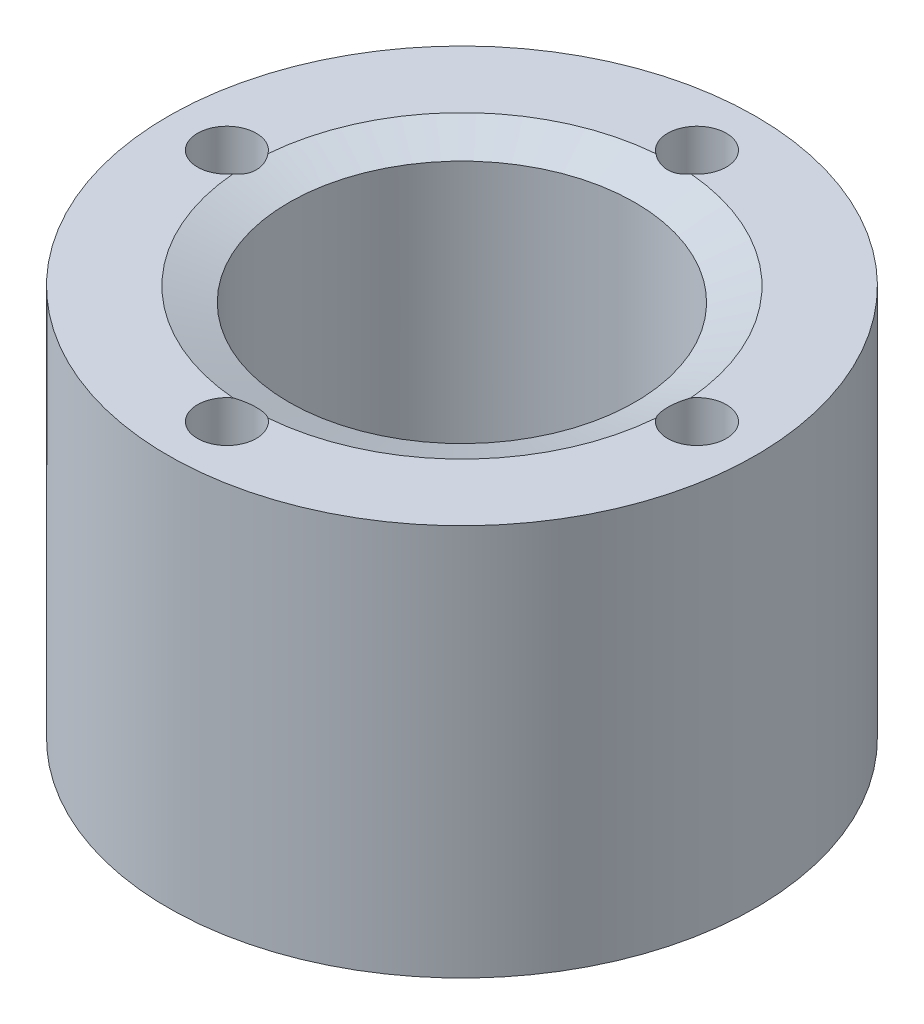
ISO-10303-21;
HEADER;
FILE_DESCRIPTION(('STEP AP214'),'2;1');
FILE_NAME('part.step','',(''),(''),'','','');
FILE_SCHEMA(('AUTOMOTIVE_DESIGN { 1 0 10303 214 1 1 1 1 }'));
ENDSEC;
DATA;
#1=APPLICATION_CONTEXT('core data for automotive mechanical design processes');
#2=APPLICATION_PROTOCOL_DEFINITION('international standard','automotive_design',2000,#1);
#3=PRODUCT_CONTEXT('',#1,'mechanical');
#4=PRODUCT('Part','Part','',(#3));
#5=PRODUCT_RELATED_PRODUCT_CATEGORY('part','',(#4));
#6=PRODUCT_DEFINITION_FORMATION('','',#4);
#7=PRODUCT_DEFINITION_CONTEXT('part definition',#1,'design');
#8=PRODUCT_DEFINITION('design','',#6,#7);
#9=PRODUCT_DEFINITION_SHAPE('','',#8);
#10=(LENGTH_UNIT() NAMED_UNIT(*) SI_UNIT(.MILLI.,.METRE.));
#11=(NAMED_UNIT(*) PLANE_ANGLE_UNIT() SI_UNIT($,.RADIAN.));
#12=(NAMED_UNIT(*) SI_UNIT($,.STERADIAN.) SOLID_ANGLE_UNIT());
#13=UNCERTAINTY_MEASURE_WITH_UNIT(LENGTH_MEASURE(1.E-05),#10,'distance_accuracy_value','');
#14=(GEOMETRIC_REPRESENTATION_CONTEXT(3) GLOBAL_UNCERTAINTY_ASSIGNED_CONTEXT((#13)) GLOBAL_UNIT_ASSIGNED_CONTEXT((#10,
#11,#12)) REPRESENTATION_CONTEXT('',''));
#15=CARTESIAN_POINT('',(0.,0.,0.));
#16=DIRECTION('',(0.,0.,1.));
#17=DIRECTION('',(1.,0.,0.));
#18=AXIS2_PLACEMENT_3D('',#15,#16,#17);
#19=CARTESIAN_POINT('',(0.,30.,0.));
#20=DIRECTION('',(0.,-1.,0.));
#21=DIRECTION('',(0.,0.,-1.));
#22=AXIS2_PLACEMENT_3D('',#19,#20,#21);
#23=CYLINDRICAL_SURFACE('',#22,13.25);
#24=CARTESIAN_POINT('',(0.,28.9080892972014,0.));
#25=DIRECTION('',(0.,1.,0.));
#26=DIRECTION('',(0.,0.,1.));
#27=AXIS2_PLACEMENT_3D('',#24,#25,#26);
#28=CIRCLE('',#27,13.25);
#29=CARTESIAN_POINT('',(0.,28.9080892972014,13.25));
#30=VERTEX_POINT('',#29);
#31=EDGE_CURVE('E98',#30,#30,#28,.T.);
#32=ORIENTED_EDGE('',*,*,#31,.T.);
#33=EDGE_LOOP('',(#32));
#34=FACE_BOUND('',#33,.T.);
#35=CARTESIAN_POINT('',(0.,1.09191070279863,0.));
#36=DIRECTION('',(0.,-1.,0.));
#37=DIRECTION('',(0.,0.,-1.));
#38=AXIS2_PLACEMENT_3D('',#35,#36,#37);
#39=CIRCLE('',#38,13.25);
#40=CARTESIAN_POINT('',(0.,1.09191070279863,-13.25));
#41=VERTEX_POINT('',#40);
#42=EDGE_CURVE('E199',#41,#41,#39,.T.);
#43=ORIENTED_EDGE('',*,*,#42,.T.);
#44=EDGE_LOOP('',(#43));
#45=FACE_BOUND('',#44,.T.);
#46=ADVANCED_FACE('F16',(#34,#45),#23,.F.);
#47=CARTESIAN_POINT('',(0.,30.,0.));
#48=DIRECTION('',(0.,1.,0.));
#49=DIRECTION('',(-1.,0.,0.));
#50=AXIS2_PLACEMENT_3D('',#47,#48,#49);
#51=CONICAL_SURFACE('',#50,16.25,1.22173047639602);
#52=CARTESIAN_POINT('',(-1.34256066373274,30.,16.1944444444445));
#53=CARTESIAN_POINT('',(-1.29503569508663,29.9857533773835,16.1591074446449));
#54=CARTESIAN_POINT('',(-1.24600466792052,29.9721782862931,16.125564186826));
#55=CARTESIAN_POINT('',(-1.14515117916577,29.9464959238673,16.0623007528374));
#56=CARTESIAN_POINT('',(-1.09332792171034,29.9343890742543,16.0325816749361));
#57=CARTESIAN_POINT('',(-0.933986717875354,29.9004578134465,15.9495137717135));
#58=CARTESIAN_POINT('',(-0.82264848283137,29.8810381470335,15.9022924579782));
#59=CARTESIAN_POINT('',(-0.594410366992921,29.8498309644823,15.8266483902487));
#60=CARTESIAN_POINT('',(-0.477601098527234,29.8379479385341,15.7979902861387));
#61=CARTESIAN_POINT('',(-0.240524023694858,29.8220455159651,15.7596796530654));
#62=CARTESIAN_POINT('',(-0.120261376206534,29.8180149517097,15.7500001329639));
#63=CARTESIAN_POINT('',(0.119581532663591,29.8180148144133,15.7499998677877));
#64=CARTESIAN_POINT('',(0.239161808378006,29.8219998009926,15.7595699959227));
#65=CARTESIAN_POINT('',(0.474930831243424,29.8377238392663,15.7974499501194));
#66=CARTESIAN_POINT('',(0.59111460472309,29.8494737204589,15.8257859485747));
#67=CARTESIAN_POINT('',(0.819501545613403,29.8805154499194,15.9010220625527));
#68=CARTESIAN_POINT('',(0.931537054048236,29.8999853076737,15.9483606908741));
#69=CARTESIAN_POINT('',(1.09185399022661,29.934051173427,16.0317526739331));
#70=CARTESIAN_POINT('',(1.1439938037957,29.9462136866357,16.0616067087508));
#71=CARTESIAN_POINT('',(1.2454496791413,29.9720247024115,16.1251846888387));
#72=CARTESIAN_POINT('',(1.29476658412527,29.9856727576729,16.1589074693706));
#73=CARTESIAN_POINT('',(1.34256066373274,30.,16.1944444444445));
#74=B_SPLINE_CURVE_WITH_KNOTS('',3,(#52,#53,#54,#55,#56,#57,#58,#59,#60,#61,#62,#63,#64,#65,#66,
#67,#68,#69,#70,#71,#72,#73),.UNSPECIFIED.,.F.,.F.,(4,2,2,2,2,2,2,2,2,2,4),(0.,
0.182638632111473,0.365329599802466,0.730906159337628,1.09175208207853,1.45208444031118,
1.81037982179547,2.1691759661915,2.53677725279807,2.72050348857454,2.90417455552269),.UNSPECIFIED.);
#75=CARTESIAN_POINT('',(-1.34256066373275,30.,16.1944444444444));
#76=VERTEX_POINT('',#75);
#77=CARTESIAN_POINT('',(1.34256066373274,30.,16.1944444444444));
#78=VERTEX_POINT('',#77);
#79=EDGE_CURVE('E19',#76,#78,#74,.T.);
#80=ORIENTED_EDGE('',*,*,#79,.T.);
#81=CARTESIAN_POINT('',(0.,30.,0.));
#82=DIRECTION('',(0.,1.,0.));
#83=DIRECTION('',(-1.,0.,0.));
#84=AXIS2_PLACEMENT_3D('',#81,#82,#83);
#85=CIRCLE('',#84,16.25);
#86=CARTESIAN_POINT('',(16.1944444444444,30.,1.34256066373274));
#87=VERTEX_POINT('',#86);
#88=EDGE_CURVE('E91',#87,#78,#85,.F.);
#89=ORIENTED_EDGE('',*,*,#88,.F.);
#90=CARTESIAN_POINT('',(16.1944444444445,30.,1.34256066373273));
#91=CARTESIAN_POINT('',(16.159110134315,29.985754459926,1.29503946985212));
#92=CARTESIAN_POINT('',(16.1255692402411,29.9721803304749,1.24601213187014));
#93=CARTESIAN_POINT('',(16.0623103242905,29.9464998167678,1.14516703091528));
#94=CARTESIAN_POINT('',(16.0325933538891,29.9343938362654,1.09334850597466));
#95=CARTESIAN_POINT('',(15.9495215123837,29.9004609925795,0.934005193148864));
#96=CARTESIAN_POINT('',(15.9022959346177,29.8810395590758,0.822659940178594));
#97=CARTESIAN_POINT('',(15.8260755658941,29.8495946664111,0.59268103538089));
#98=CARTESIAN_POINT('',(15.7971177117628,29.8375861971003,0.474033145787141));
#99=CARTESIAN_POINT('',(15.7588103820512,29.8216841974014,0.233232691182156));
#100=CARTESIAN_POINT('',(15.7494313179909,29.8177784218589,0.111085697834837));
#101=CARTESIAN_POINT('',(15.750601997425,29.8182652050651,-0.128891085036639));
#102=CARTESIAN_POINT('',(15.7604795811715,29.8223778776123,-0.246725326555691));
#103=CARTESIAN_POINT('',(15.7984317016072,29.8381308451059,-0.479037068103916));
#104=CARTESIAN_POINT('',(15.8265300121784,29.8497809746649,-0.593509978101817));
#105=CARTESIAN_POINT('',(15.9012743072178,29.8806192553182,-0.820124558448079));
#106=CARTESIAN_POINT('',(15.9485849998499,29.9000772191653,-0.932012026448576));
#107=CARTESIAN_POINT('',(16.0319076583594,29.9341143449175,-1.09212989280819));
#108=CARTESIAN_POINT('',(16.0617366828625,29.9462665417624,-1.14421075514716));
#109=CARTESIAN_POINT('',(16.1252559511259,29.9720535435632,-1.24555384216829));
#110=CARTESIAN_POINT('',(16.1589449967141,29.9856878883851,-1.29481693442214));
#111=CARTESIAN_POINT('',(16.1944444444444,30.,-1.34256066373274));
#112=B_SPLINE_CURVE_WITH_KNOTS('',3,(#90,#91,#92,#93,#94,#95,#96,#97,#98,#99,#100,#101,#102,
#103,#104,#105,#106,#107,#108,#109,#110,#111),.UNSPECIFIED.,.F.,.F.,(4,2,2,2,2,2,2,2,2,2,4),(0.,
0.182624936310918,0.365299982701682,0.730906079889577,1.09724907271524,1.46303802706697,
1.81628732380458,2.16999846002199,2.5371607603491,2.72069469678008,2.9041718167991),.UNSPECIFIED.);
#113=CARTESIAN_POINT('',(16.1944444444444,30.,-1.34256066373274));
#114=VERTEX_POINT('',#113);
#115=EDGE_CURVE('E126',#87,#114,#112,.T.);
#116=ORIENTED_EDGE('',*,*,#115,.T.);
#117=CARTESIAN_POINT('',(0.,30.,0.));
#118=DIRECTION('',(0.,1.,0.));
#119=DIRECTION('',(-1.,0.,0.));
#120=AXIS2_PLACEMENT_3D('',#117,#118,#119);
#121=CIRCLE('',#120,16.25);
#122=CARTESIAN_POINT('',(1.34256066373275,30.,-16.1944444444444));
#123=VERTEX_POINT('',#122);
#124=EDGE_CURVE('E107',#123,#114,#121,.F.);
#125=ORIENTED_EDGE('',*,*,#124,.F.);
#126=CARTESIAN_POINT('',(1.34256066373274,30.,-16.1944444444445));
#127=CARTESIAN_POINT('',(1.29503569508663,29.9857533773835,-16.1591074446449));
#128=CARTESIAN_POINT('',(1.24600466792052,29.9721782862931,-16.125564186826));
#129=CARTESIAN_POINT('',(1.14515117916578,29.9464959238673,-16.0623007528374));
#130=CARTESIAN_POINT('',(1.09332792171034,29.9343890742543,-16.0325816749361));
#131=CARTESIAN_POINT('',(0.933986717875358,29.9004578134465,-15.9495137717135));
#132=CARTESIAN_POINT('',(0.822648482831374,29.8810381470335,-15.9022924579782));
#133=CARTESIAN_POINT('',(0.594410366992925,29.8498309644823,-15.8266483902487));
#134=CARTESIAN_POINT('',(0.477601098527238,29.8379479385341,-15.7979902861387));
#135=CARTESIAN_POINT('',(0.240524023694862,29.8220455159651,-15.7596796530654));
#136=CARTESIAN_POINT('',(0.120261376206539,29.8180149517097,-15.7500001329639));
#137=CARTESIAN_POINT('',(-0.119581532663586,29.8180148144133,-15.7499998677877));
#138=CARTESIAN_POINT('',(-0.239161808378,29.8219998009926,-15.7595699959227));
#139=CARTESIAN_POINT('',(-0.474930831243418,29.8377238392663,-15.7974499501194));
#140=CARTESIAN_POINT('',(-0.591114604723084,29.8494737204589,-15.8257859485747));
#141=CARTESIAN_POINT('',(-0.819501545613396,29.8805154499194,-15.9010220625527));
#142=CARTESIAN_POINT('',(-0.931537054048228,29.8999853076737,-15.9483606908741));
#143=CARTESIAN_POINT('',(-1.09185399022661,29.934051173427,-16.0317526739331));
#144=CARTESIAN_POINT('',(-1.1439938037957,29.9462136866357,-16.0616067087508));
#145=CARTESIAN_POINT('',(-1.24544967914129,29.9720247024115,-16.1251846888387));
#146=CARTESIAN_POINT('',(-1.29476658412526,29.9856727576729,-16.1589074693706));
#147=CARTESIAN_POINT('',(-1.34256066373273,30.,-16.1944444444444));
#148=B_SPLINE_CURVE_WITH_KNOTS('',3,(#126,#127,#128,#129,#130,#131,#132,#133,#134,#135,#136,
#137,#138,#139,#140,#141,#142,#143,#144,#145,#146,#147),.UNSPECIFIED.,.F.,.F.,(4,2,2,2,2,2,2,2,
2,2,4),(0.,0.182638632111473,0.365329599802466,0.730906159337632,1.09175208207853,
1.45208444031118,1.81037982179547,2.1691759661915,2.53677725279807,2.72050348857454,
2.90417455552268),.UNSPECIFIED.);
#149=CARTESIAN_POINT('',(-1.34256066373273,30.,-16.1944444444444));
#150=VERTEX_POINT('',#149);
#151=EDGE_CURVE('E187',#123,#150,#148,.T.);
#152=ORIENTED_EDGE('',*,*,#151,.T.);
#153=CARTESIAN_POINT('',(0.,30.,0.));
#154=DIRECTION('',(0.,1.,0.));
#155=DIRECTION('',(-1.,0.,0.));
#156=AXIS2_PLACEMENT_3D('',#153,#154,#155);
#157=CIRCLE('',#156,16.25);
#158=CARTESIAN_POINT('',(-16.1944444444444,30.,-1.34256066373275));
#159=VERTEX_POINT('',#158);
#160=EDGE_CURVE('E115',#159,#150,#157,.F.);
#161=ORIENTED_EDGE('',*,*,#160,.F.);
#162=CARTESIAN_POINT('',(-16.1944444444445,30.,-1.34256066373274));
#163=CARTESIAN_POINT('',(-16.159110134315,29.985754459926,-1.29503946985214));
#164=CARTESIAN_POINT('',(-16.1255692402411,29.9721803304749,-1.24601213187015));
#165=CARTESIAN_POINT('',(-16.0623103242905,29.9464998167678,-1.1451670309153));
#166=CARTESIAN_POINT('',(-16.0325933538891,29.9343938362654,-1.09334850597468));
#167=CARTESIAN_POINT('',(-15.9495215123837,29.9004609925795,-0.934005193148878));
#168=CARTESIAN_POINT('',(-15.9022959346177,29.8810395590758,-0.82265994017861));
#169=CARTESIAN_POINT('',(-15.8260755658941,29.8495946664111,-0.592681035380907));
#170=CARTESIAN_POINT('',(-15.7971177117628,29.8375861971003,-0.474033145787157));
#171=CARTESIAN_POINT('',(-15.7588103820512,29.8216841974014,-0.233232691182173));
#172=CARTESIAN_POINT('',(-15.7494313179909,29.8177784218589,-0.111085697834854));
#173=CARTESIAN_POINT('',(-15.750601997425,29.8182652050651,0.128891085036622));
#174=CARTESIAN_POINT('',(-15.7604795811715,29.8223778776123,0.246725326555674));
#175=CARTESIAN_POINT('',(-15.7984317016072,29.8381308451059,0.479037068103899));
#176=CARTESIAN_POINT('',(-15.8265300121784,29.8497809746649,0.5935099781018));
#177=CARTESIAN_POINT('',(-15.9012743072178,29.8806192553182,0.820124558448067));
#178=CARTESIAN_POINT('',(-15.9485849998499,29.9000772191653,0.932012026448567));
#179=CARTESIAN_POINT('',(-16.0319076583594,29.9341143449175,1.09212989280819));
#180=CARTESIAN_POINT('',(-16.0617366828625,29.9462665417624,1.14421075514716));
#181=CARTESIAN_POINT('',(-16.1252559511259,29.9720535435632,1.24555384216829));
#182=CARTESIAN_POINT('',(-16.1589449967141,29.9856878883851,1.29481693442215));
#183=CARTESIAN_POINT('',(-16.1944444444444,30.,1.34256066373274));
#184=B_SPLINE_CURVE_WITH_KNOTS('',3,(#162,#163,#164,#165,#166,#167,#168,#169,#170,#171,#172,
#173,#174,#175,#176,#177,#178,#179,#180,#181,#182,#183),.UNSPECIFIED.,.F.,.F.,(4,2,2,2,2,2,2,2,
2,2,4),(0.,0.182624936310919,0.365299982701681,0.730906079889576,1.09724907271524,
1.46303802706697,1.81628732380458,2.16999846002199,2.53716076034912,2.7206946967801,
2.90417181679912),.UNSPECIFIED.);
#185=CARTESIAN_POINT('',(-16.1944444444444,30.,1.34256066373274));
#186=VERTEX_POINT('',#185);
#187=EDGE_CURVE('E97',#159,#186,#184,.T.);
#188=ORIENTED_EDGE('',*,*,#187,.T.);
#189=CARTESIAN_POINT('',(0.,30.,0.));
#190=DIRECTION('',(0.,1.,0.));
#191=DIRECTION('',(-1.,0.,0.));
#192=AXIS2_PLACEMENT_3D('',#189,#190,#191);
#193=CIRCLE('',#192,16.25);
#194=EDGE_CURVE('E95',#76,#186,#193,.F.);
#195=ORIENTED_EDGE('',*,*,#194,.F.);
#196=EDGE_LOOP('',(#80,#89,#116,#125,#152,#161,#188,#195));
#197=FACE_BOUND('',#196,.T.);
#198=ORIENTED_EDGE('',*,*,#31,.F.);
#199=EDGE_LOOP('',(#198));
#200=FACE_BOUND('',#199,.T.);
#201=ADVANCED_FACE('F87',(#197,#200),#51,.F.);
#202=CARTESIAN_POINT('',(0.,30.,18.));
#203=DIRECTION('',(0.,-1.,0.));
#204=DIRECTION('',(0.,0.,-1.));
#205=AXIS2_PLACEMENT_3D('',#202,#203,#204);
#206=CYLINDRICAL_SURFACE('',#205,2.25);
#207=CARTESIAN_POINT('',(0.,0.,18.));
#208=DIRECTION('',(0.,-1.,0.));
#209=DIRECTION('',(0.,0.,-1.));
#210=AXIS2_PLACEMENT_3D('',#207,#208,#209);
#211=CIRCLE('',#210,2.25);
#212=CARTESIAN_POINT('',(1.34256066373275,0.,16.1944444444444));
#213=VERTEX_POINT('',#212);
#214=CARTESIAN_POINT('',(-1.34256066373273,0.,16.1944444444444));
#215=VERTEX_POINT('',#214);
#216=EDGE_CURVE('E173',#213,#215,#211,.T.);
#217=ORIENTED_EDGE('',*,*,#216,.T.);
#218=CARTESIAN_POINT('',(-1.34256066373273,0.,16.1944444444444));
#219=CARTESIAN_POINT('',(-1.29503569508662,0.0142466226164699,16.1591074446449));
#220=CARTESIAN_POINT('',(-1.24600466792051,0.0278217137069305,16.125564186826));
#221=CARTESIAN_POINT('',(-1.14515117916577,0.0535040761326943,16.0623007528374));
#222=CARTESIAN_POINT('',(-1.09332792171033,0.0656109257457098,16.0325816749361));
#223=CARTESIAN_POINT('',(-0.933986717875347,0.0995421865535054,15.9495137717135));
#224=CARTESIAN_POINT('',(-0.822648482831363,0.11896185296652,15.9022924579782));
#225=CARTESIAN_POINT('',(-0.594410366992914,0.15016903551766,15.8266483902487));
#226=CARTESIAN_POINT('',(-0.477601098527227,0.16205206146588,15.7979902861387));
#227=CARTESIAN_POINT('',(-0.240524023694854,0.177954484034902,15.7596796530654));
#228=CARTESIAN_POINT('',(-0.120261376206532,0.181985048290327,15.7500001329639));
#229=CARTESIAN_POINT('',(0.119581532663591,0.181985185586717,15.7499998677877));
#230=CARTESIAN_POINT('',(0.239161808378005,0.178000199007441,15.7595699959227));
#231=CARTESIAN_POINT('',(0.474930831243423,0.162276160733746,15.7974499501194));
#232=CARTESIAN_POINT('',(0.591114604723089,0.150526279541051,15.8257859485747));
#233=CARTESIAN_POINT('',(0.819501545613403,0.119484550080599,15.9010220625527));
#234=CARTESIAN_POINT('',(0.931537054048235,0.100014692326252,15.9483606908741));
#235=CARTESIAN_POINT('',(1.09185399022661,0.0659488265730061,16.0317526739331));
#236=CARTESIAN_POINT('',(1.1439938037957,0.0537863133642726,16.0616067087508));
#237=CARTESIAN_POINT('',(1.2454496791413,0.027975297588502,16.1251846888387));
#238=CARTESIAN_POINT('',(1.29476658412527,0.0143272423270716,16.1589074693706));
#239=CARTESIAN_POINT('',(1.34256066373274,0.,16.1944444444445));
#240=B_SPLINE_CURVE_WITH_KNOTS('',3,(#218,#219,#220,#221,#222,#223,#224,#225,#226,#227,#228,
#229,#230,#231,#232,#233,#234,#235,#236,#237,#238,#239),.UNSPECIFIED.,.F.,.F.,(4,2,2,2,2,2,2,2,
2,2,4),(0.,0.182638632111475,0.365329599802468,0.730906159337632,1.09175208207853,
1.45208444031118,1.81037982179546,2.16917596619149,2.53677725279806,2.72050348857454,
2.90417455552268),.UNSPECIFIED.);
#241=EDGE_CURVE('E190',#215,#213,#240,.T.);
#242=ORIENTED_EDGE('',*,*,#241,.T.);
#243=EDGE_LOOP('',(#217,#242));
#244=FACE_BOUND('',#243,.T.);
#245=CARTESIAN_POINT('',(0.,30.,18.));
#246=DIRECTION('',(0.,-1.,0.));
#247=DIRECTION('',(0.,0.,-1.));
#248=AXIS2_PLACEMENT_3D('',#245,#246,#247);
#249=CIRCLE('',#248,2.25);
#250=EDGE_CURVE('E99',#78,#76,#249,.T.);
#251=ORIENTED_EDGE('',*,*,#250,.F.);
#252=ORIENTED_EDGE('',*,*,#79,.F.);
#253=EDGE_LOOP('',(#251,#252));
#254=FACE_BOUND('',#253,.T.);
#255=ADVANCED_FACE('F100',(#244,#254),#206,.F.);
#256=CARTESIAN_POINT('',(-18.,30.,0.));
#257=DIRECTION('',(0.,-1.,0.));
#258=DIRECTION('',(0.,0.,-1.));
#259=AXIS2_PLACEMENT_3D('',#256,#257,#258);
#260=CYLINDRICAL_SURFACE('',#259,2.25);
#261=ORIENTED_EDGE('',*,*,#187,.F.);
#262=CARTESIAN_POINT('',(-18.,30.,0.));
#263=DIRECTION('',(0.,-1.,0.));
#264=DIRECTION('',(0.,0.,-1.));
#265=AXIS2_PLACEMENT_3D('',#262,#263,#264);
#266=CIRCLE('',#265,2.25);
#267=EDGE_CURVE('E179',#186,#159,#266,.T.);
#268=ORIENTED_EDGE('',*,*,#267,.F.);
#269=EDGE_LOOP('',(#261,#268));
#270=FACE_BOUND('',#269,.T.);
#271=CARTESIAN_POINT('',(-16.1944444444444,0.,-1.34256066373274));
#272=CARTESIAN_POINT('',(-16.159110134315,0.0142455400739537,-1.29503946985213));
#273=CARTESIAN_POINT('',(-16.1255692402411,0.0278196695250839,-1.24601213187015));
#274=CARTESIAN_POINT('',(-16.0623103242905,0.0535001832321958,-1.14516703091529));
#275=CARTESIAN_POINT('',(-16.0325933538891,0.0656061637346198,-1.09334850597467));
#276=CARTESIAN_POINT('',(-15.9495215123837,0.0995390074204952,-0.934005193148875));
#277=CARTESIAN_POINT('',(-15.9022959346177,0.11896044092423,-0.822659940178607));
#278=CARTESIAN_POINT('',(-15.8260755658941,0.150405333588943,-0.592681035380904));
#279=CARTESIAN_POINT('',(-15.7971177117628,0.162413802899697,-0.474033145787155));
#280=CARTESIAN_POINT('',(-15.7588103820512,0.178315802598592,-0.23323269118217));
#281=CARTESIAN_POINT('',(-15.7494313179909,0.182221578141065,-0.111085697834851));
#282=CARTESIAN_POINT('',(-15.750601997425,0.181734794934854,0.128891085036625));
#283=CARTESIAN_POINT('',(-15.7604795811715,0.177622122387718,0.246725326555676));
#284=CARTESIAN_POINT('',(-15.7984317016072,0.161869154894065,0.479037068103902));
#285=CARTESIAN_POINT('',(-15.8265300121784,0.150219025335082,0.593509978101804));
#286=CARTESIAN_POINT('',(-15.9012743072178,0.119380744681766,0.82012455844807));
#287=CARTESIAN_POINT('',(-15.9485849998499,0.0999227808347119,0.93201202644857));
#288=CARTESIAN_POINT('',(-16.0319076583594,0.0658856550825451,1.09212989280819));
#289=CARTESIAN_POINT('',(-16.0617366828625,0.0537334582376023,1.14421075514716));
#290=CARTESIAN_POINT('',(-16.1252559511259,0.0279464564367543,1.24555384216829));
#291=CARTESIAN_POINT('',(-16.1589449967141,0.0143121116148982,1.29481693442215));
#292=CARTESIAN_POINT('',(-16.1944444444445,0.,1.34256066373274));
#293=B_SPLINE_CURVE_WITH_KNOTS('',3,(#271,#272,#273,#274,#275,#276,#277,#278,#279,#280,#281,
#282,#283,#284,#285,#286,#287,#288,#289,#290,#291,#292),.UNSPECIFIED.,.F.,.F.,(4,2,2,2,2,2,2,2,
2,2,4),(0.,0.182624936310922,0.365299982701683,0.730906079889576,1.09724907271524,
1.46303802706697,1.81628732380458,2.16999846002199,2.53716076034912,2.7206946967801,
2.90417181679913),.UNSPECIFIED.);
#294=CARTESIAN_POINT('',(-16.1944444444444,0.,-1.34256066373274));
#295=VERTEX_POINT('',#294);
#296=CARTESIAN_POINT('',(-16.1944444444444,0.,1.34256066373275));
#297=VERTEX_POINT('',#296);
#298=EDGE_CURVE('E185',#295,#297,#293,.T.);
#299=ORIENTED_EDGE('',*,*,#298,.T.);
#300=CARTESIAN_POINT('',(-18.,0.,0.));
#301=DIRECTION('',(0.,-1.,0.));
#302=DIRECTION('',(0.,0.,-1.));
#303=AXIS2_PLACEMENT_3D('',#300,#301,#302);
#304=CIRCLE('',#303,2.25);
#305=EDGE_CURVE('E168',#297,#295,#304,.T.);
#306=ORIENTED_EDGE('',*,*,#305,.T.);
#307=EDGE_LOOP('',(#299,#306));
#308=FACE_BOUND('',#307,.T.);
#309=ADVANCED_FACE('F183',(#270,#308),#260,.F.);
#310=CARTESIAN_POINT('',(0.,30.,-18.));
#311=DIRECTION('',(0.,-1.,0.));
#312=DIRECTION('',(0.,0.,-1.));
#313=AXIS2_PLACEMENT_3D('',#310,#311,#312);
#314=CYLINDRICAL_SURFACE('',#313,2.25);
#315=CARTESIAN_POINT('',(0.,30.,-18.));
#316=DIRECTION('',(0.,-1.,0.));
#317=DIRECTION('',(0.,0.,-1.));
#318=AXIS2_PLACEMENT_3D('',#315,#316,#317);
#319=CIRCLE('',#318,2.25);
#320=EDGE_CURVE('E112',#150,#123,#319,.T.);
#321=ORIENTED_EDGE('',*,*,#320,.F.);
#322=ORIENTED_EDGE('',*,*,#151,.F.);
#323=EDGE_LOOP('',(#321,#322));
#324=FACE_BOUND('',#323,.T.);
#325=CARTESIAN_POINT('',(1.34256066373274,0.,-16.1944444444445));
#326=CARTESIAN_POINT('',(1.29503569508663,0.0142466226164696,-16.1591074446449));
#327=CARTESIAN_POINT('',(1.24600466792052,0.0278217137069297,-16.125564186826));
#328=CARTESIAN_POINT('',(1.14515117916578,0.0535040761326927,-16.0623007528374));
#329=CARTESIAN_POINT('',(1.09332792171034,0.0656109257457077,-16.0325816749361));
#330=CARTESIAN_POINT('',(0.933986717875358,0.0995421865535031,-15.9495137717135));
#331=CARTESIAN_POINT('',(0.822648482831374,0.118961852966519,-15.9022924579782));
#332=CARTESIAN_POINT('',(0.594410366992925,0.150169035517661,-15.8266483902487));
#333=CARTESIAN_POINT('',(0.477601098527237,0.16205206146588,-15.7979902861387));
#334=CARTESIAN_POINT('',(0.240524023694861,0.177954484034902,-15.7596796530654));
#335=CARTESIAN_POINT('',(0.120261376206538,0.181985048290327,-15.7500001329639));
#336=CARTESIAN_POINT('',(-0.119581532663587,0.181985185586717,-15.7499998677877));
#337=CARTESIAN_POINT('',(-0.239161808378001,0.178000199007441,-15.7595699959227));
#338=CARTESIAN_POINT('',(-0.474930831243419,0.162276160733746,-15.7974499501194));
#339=CARTESIAN_POINT('',(-0.591114604723085,0.150526279541051,-15.8257859485747));
#340=CARTESIAN_POINT('',(-0.819501545613398,0.119484550080598,-15.9010220625527));
#341=CARTESIAN_POINT('',(-0.93153705404823,0.100014692326252,-15.9483606908741));
#342=CARTESIAN_POINT('',(-1.09185399022661,0.065948826573006,-16.0317526739331));
#343=CARTESIAN_POINT('',(-1.1439938037957,0.0537863133642726,-16.0616067087508));
#344=CARTESIAN_POINT('',(-1.24544967914129,0.027975297588502,-16.1251846888387));
#345=CARTESIAN_POINT('',(-1.29476658412526,0.0143272423270717,-16.1589074693706));
#346=CARTESIAN_POINT('',(-1.34256066373273,0.,-16.1944444444445));
#347=B_SPLINE_CURVE_WITH_KNOTS('',3,(#325,#326,#327,#328,#329,#330,#331,#332,#333,#334,#335,
#336,#337,#338,#339,#340,#341,#342,#343,#344,#345,#346),.UNSPECIFIED.,.F.,.F.,(4,2,2,2,2,2,2,2,
2,2,4),(0.,0.182638632111472,0.365329599802466,0.730906159337631,1.09175208207854,
1.45208444031119,1.81037982179547,2.1691759661915,2.53677725279807,2.72050348857454,
2.90417455552269),.UNSPECIFIED.);
#348=CARTESIAN_POINT('',(1.34256066373274,0.,-16.1944444444444));
#349=VERTEX_POINT('',#348);
#350=CARTESIAN_POINT('',(-1.34256066373274,0.,-16.1944444444444));
#351=VERTEX_POINT('',#350);
#352=EDGE_CURVE('E196',#349,#351,#347,.T.);
#353=ORIENTED_EDGE('',*,*,#352,.T.);
#354=CARTESIAN_POINT('',(0.,0.,-18.));
#355=DIRECTION('',(0.,-1.,0.));
#356=DIRECTION('',(0.,0.,-1.));
#357=AXIS2_PLACEMENT_3D('',#354,#355,#356);
#358=CIRCLE('',#357,2.25);
#359=EDGE_CURVE('E163',#351,#349,#358,.T.);
#360=ORIENTED_EDGE('',*,*,#359,.T.);
#361=EDGE_LOOP('',(#353,#360));
#362=FACE_BOUND('',#361,.T.);
#363=ADVANCED_FACE('F192',(#324,#362),#314,.F.);
#364=CARTESIAN_POINT('',(0.,0.,0.));
#365=DIRECTION('',(0.,-1.,0.));
#366=DIRECTION('',(0.,0.,-1.));
#367=AXIS2_PLACEMENT_3D('',#364,#365,#366);
#368=CONICAL_SURFACE('',#367,16.25,1.22173047639602);
#369=ORIENTED_EDGE('',*,*,#42,.F.);
#370=EDGE_LOOP('',(#369));
#371=FACE_BOUND('',#370,.T.);
#372=CARTESIAN_POINT('',(0.,0.,0.));
#373=DIRECTION('',(0.,-1.,0.));
#374=DIRECTION('',(0.,0.,-1.));
#375=AXIS2_PLACEMENT_3D('',#372,#373,#374);
#376=CIRCLE('',#375,16.25);
#377=EDGE_CURVE('E165',#295,#351,#376,.T.);
#378=ORIENTED_EDGE('',*,*,#377,.T.);
#379=ORIENTED_EDGE('',*,*,#352,.F.);
#380=CARTESIAN_POINT('',(0.,0.,0.));
#381=DIRECTION('',(0.,-1.,0.));
#382=DIRECTION('',(0.,0.,-1.));
#383=AXIS2_PLACEMENT_3D('',#380,#381,#382);
#384=CIRCLE('',#383,16.25);
#385=CARTESIAN_POINT('',(16.1944444444444,0.,-1.34256066373275));
#386=VERTEX_POINT('',#385);
#387=EDGE_CURVE('E158',#349,#386,#384,.T.);
#388=ORIENTED_EDGE('',*,*,#387,.T.);
#389=CARTESIAN_POINT('',(16.1944444444444,0.,-1.34256066373274));
#390=CARTESIAN_POINT('',(16.159110134315,0.0142455400739532,-1.29503946985213));
#391=CARTESIAN_POINT('',(16.1255692402411,0.0278196695250831,-1.24601213187014));
#392=CARTESIAN_POINT('',(16.0623103242905,0.0535001832321949,-1.14516703091529));
#393=CARTESIAN_POINT('',(16.0325933538891,0.0656061637346189,-1.09334850597467));
#394=CARTESIAN_POINT('',(15.9495215123837,0.0995390074204942,-0.93400519314887));
#395=CARTESIAN_POINT('',(15.9022959346177,0.118960440924229,-0.822659940178601));
#396=CARTESIAN_POINT('',(15.8260755658941,0.150405333588941,-0.592681035380899));
#397=CARTESIAN_POINT('',(15.7971177117628,0.162413802899695,-0.474033145787149));
#398=CARTESIAN_POINT('',(15.7588103820512,0.17831580259859,-0.233232691182164));
#399=CARTESIAN_POINT('',(15.7494313179909,0.182221578141063,-0.111085697834845));
#400=CARTESIAN_POINT('',(15.750601997425,0.181734794934851,0.128891085036631));
#401=CARTESIAN_POINT('',(15.7604795811715,0.177622122387716,0.246725326555682));
#402=CARTESIAN_POINT('',(15.7984317016072,0.161869154894062,0.479037068103908));
#403=CARTESIAN_POINT('',(15.8265300121784,0.150219025335078,0.59350997810181));
#404=CARTESIAN_POINT('',(15.9012743072178,0.119380744681763,0.820124558448071));
#405=CARTESIAN_POINT('',(15.9485849998499,0.0999227808347093,0.932012026448568));
#406=CARTESIAN_POINT('',(16.0319076583594,0.0658856550825433,1.09212989280819));
#407=CARTESIAN_POINT('',(16.0617366828625,0.0537334582376007,1.14421075514715));
#408=CARTESIAN_POINT('',(16.1252559511259,0.0279464564367534,1.24555384216828));
#409=CARTESIAN_POINT('',(16.1589449967141,0.0143121116148976,1.29481693442214));
#410=CARTESIAN_POINT('',(16.1944444444445,0.,1.34256066373273));
#411=B_SPLINE_CURVE_WITH_KNOTS('',3,(#389,#390,#391,#392,#393,#394,#395,#396,#397,#398,#399,
#400,#401,#402,#403,#404,#405,#406,#407,#408,#409,#410),.UNSPECIFIED.,.F.,.F.,(4,2,2,2,2,2,2,2,
2,2,4),(0.,0.182624936310919,0.365299982701681,0.730906079889575,1.09724907271524,
1.46303802706696,1.81628732380458,2.16999846002199,2.5371607603491,2.72069469678008,
2.9041718167991),.UNSPECIFIED.);
#412=CARTESIAN_POINT('',(16.1944444444444,0.,1.34256066373273));
#413=VERTEX_POINT('',#412);
#414=EDGE_CURVE('E118',#386,#413,#411,.T.);
#415=ORIENTED_EDGE('',*,*,#414,.T.);
#416=CARTESIAN_POINT('',(0.,0.,0.));
#417=DIRECTION('',(0.,-1.,0.));
#418=DIRECTION('',(0.,0.,-1.));
#419=AXIS2_PLACEMENT_3D('',#416,#417,#418);
#420=CIRCLE('',#419,16.25);
#421=EDGE_CURVE('E176',#413,#213,#420,.T.);
#422=ORIENTED_EDGE('',*,*,#421,.T.);
#423=ORIENTED_EDGE('',*,*,#241,.F.);
#424=CARTESIAN_POINT('',(0.,0.,0.));
#425=DIRECTION('',(0.,-1.,0.));
#426=DIRECTION('',(0.,0.,-1.));
#427=AXIS2_PLACEMENT_3D('',#424,#425,#426);
#428=CIRCLE('',#427,16.25);
#429=EDGE_CURVE('E170',#215,#297,#428,.T.);
#430=ORIENTED_EDGE('',*,*,#429,.T.);
#431=ORIENTED_EDGE('',*,*,#298,.F.);
#432=EDGE_LOOP('',(#378,#379,#388,#415,#422,#423,#430,#431));
#433=FACE_BOUND('',#432,.T.);
#434=ADVANCED_FACE('F132',(#371,#433),#368,.F.);
#435=CARTESIAN_POINT('',(18.,30.,0.));
#436=DIRECTION('',(0.,-1.,0.));
#437=DIRECTION('',(0.,0.,-1.));
#438=AXIS2_PLACEMENT_3D('',#435,#436,#437);
#439=CYLINDRICAL_SURFACE('',#438,2.25);
#440=ORIENTED_EDGE('',*,*,#414,.F.);
#441=CARTESIAN_POINT('',(18.,0.,0.));
#442=DIRECTION('',(0.,-1.,0.));
#443=DIRECTION('',(0.,0.,-1.));
#444=AXIS2_PLACEMENT_3D('',#441,#442,#443);
#445=CIRCLE('',#444,2.25);
#446=EDGE_CURVE('E39',#386,#413,#445,.T.);
#447=ORIENTED_EDGE('',*,*,#446,.T.);
#448=EDGE_LOOP('',(#440,#447));
#449=FACE_BOUND('',#448,.T.);
#450=CARTESIAN_POINT('',(18.,30.,0.));
#451=DIRECTION('',(0.,-1.,0.));
#452=DIRECTION('',(0.,0.,-1.));
#453=AXIS2_PLACEMENT_3D('',#450,#451,#452);
#454=CIRCLE('',#453,2.25);
#455=EDGE_CURVE('E105',#114,#87,#454,.T.);
#456=ORIENTED_EDGE('',*,*,#455,.F.);
#457=ORIENTED_EDGE('',*,*,#115,.F.);
#458=EDGE_LOOP('',(#456,#457));
#459=FACE_BOUND('',#458,.T.);
#460=ADVANCED_FACE('F135',(#449,#459),#439,.F.);
#461=CARTESIAN_POINT('',(0.,30.,0.));
#462=DIRECTION('',(0.,1.,0.));
#463=DIRECTION('',(0.,0.,1.));
#464=AXIS2_PLACEMENT_3D('',#461,#462,#463);
#465=PLANE('',#464);
#466=CARTESIAN_POINT('',(0.,30.,0.));
#467=DIRECTION('',(0.,-1.,0.));
#468=DIRECTION('',(0.,0.,-1.));
#469=AXIS2_PLACEMENT_3D('',#466,#467,#468);
#470=CIRCLE('',#469,22.5000000000009);
#471=CARTESIAN_POINT('',(0.,30.,-22.5000000000009));
#472=VERTEX_POINT('',#471);
#473=EDGE_CURVE('E30',#472,#472,#470,.T.);
#474=ORIENTED_EDGE('',*,*,#473,.F.);
#475=EDGE_LOOP('',(#474));
#476=FACE_BOUND('',#475,.T.);
#477=ORIENTED_EDGE('',*,*,#194,.T.);
#478=ORIENTED_EDGE('',*,*,#267,.T.);
#479=ORIENTED_EDGE('',*,*,#160,.T.);
#480=ORIENTED_EDGE('',*,*,#320,.T.);
#481=ORIENTED_EDGE('',*,*,#124,.T.);
#482=ORIENTED_EDGE('',*,*,#455,.T.);
#483=ORIENTED_EDGE('',*,*,#88,.T.);
#484=ORIENTED_EDGE('',*,*,#250,.T.);
#485=EDGE_LOOP('',(#477,#478,#479,#480,#481,#482,#483,#484));
#486=FACE_BOUND('',#485,.T.);
#487=ADVANCED_FACE('F103',(#476,#486),#465,.T.);
#488=CARTESIAN_POINT('',(0.,0.,0.));
#489=DIRECTION('',(0.,1.,0.));
#490=DIRECTION('',(0.,0.,1.));
#491=AXIS2_PLACEMENT_3D('',#488,#489,#490);
#492=PLANE('',#491);
#493=ORIENTED_EDGE('',*,*,#446,.F.);
#494=ORIENTED_EDGE('',*,*,#387,.F.);
#495=ORIENTED_EDGE('',*,*,#359,.F.);
#496=ORIENTED_EDGE('',*,*,#377,.F.);
#497=ORIENTED_EDGE('',*,*,#305,.F.);
#498=ORIENTED_EDGE('',*,*,#429,.F.);
#499=ORIENTED_EDGE('',*,*,#216,.F.);
#500=ORIENTED_EDGE('',*,*,#421,.F.);
#501=EDGE_LOOP('',(#493,#494,#495,#496,#497,#498,#499,#500));
#502=FACE_BOUND('',#501,.T.);
#503=CARTESIAN_POINT('',(0.,0.,0.));
#504=DIRECTION('',(0.,-1.,0.));
#505=DIRECTION('',(0.,0.,-1.));
#506=AXIS2_PLACEMENT_3D('',#503,#504,#505);
#507=CIRCLE('',#506,22.5000000000009);
#508=CARTESIAN_POINT('',(0.,0.,-22.5000000000009));
#509=VERTEX_POINT('',#508);
#510=EDGE_CURVE('E11',#509,#509,#507,.F.);
#511=ORIENTED_EDGE('',*,*,#510,.F.);
#512=EDGE_LOOP('',(#511));
#513=FACE_BOUND('',#512,.T.);
#514=ADVANCED_FACE('F143',(#502,#513),#492,.F.);
#515=CARTESIAN_POINT('',(0.,30.,0.));
#516=DIRECTION('',(0.,-1.,0.));
#517=DIRECTION('',(0.,0.,-1.));
#518=AXIS2_PLACEMENT_3D('',#515,#516,#517);
#519=CYLINDRICAL_SURFACE('',#518,22.5000000000009);
#520=ORIENTED_EDGE('',*,*,#510,.T.);
#521=EDGE_LOOP('',(#520));
#522=FACE_BOUND('',#521,.T.);
#523=ORIENTED_EDGE('',*,*,#473,.T.);
#524=EDGE_LOOP('',(#523));
#525=FACE_BOUND('',#524,.T.);
#526=ADVANCED_FACE('F147',(#522,#525),#519,.T.);
#527=CLOSED_SHELL('',(#46,#201,#255,#309,#363,#434,#460,#487,#514,#526));
#528=MANIFOLD_SOLID_BREP('B1',#527);
#529=ADVANCED_BREP_SHAPE_REPRESENTATION('',(#18,#528),#14);
#530=SHAPE_DEFINITION_REPRESENTATION(#9,#529);
ENDSEC;
END-ISO-10303-21;
